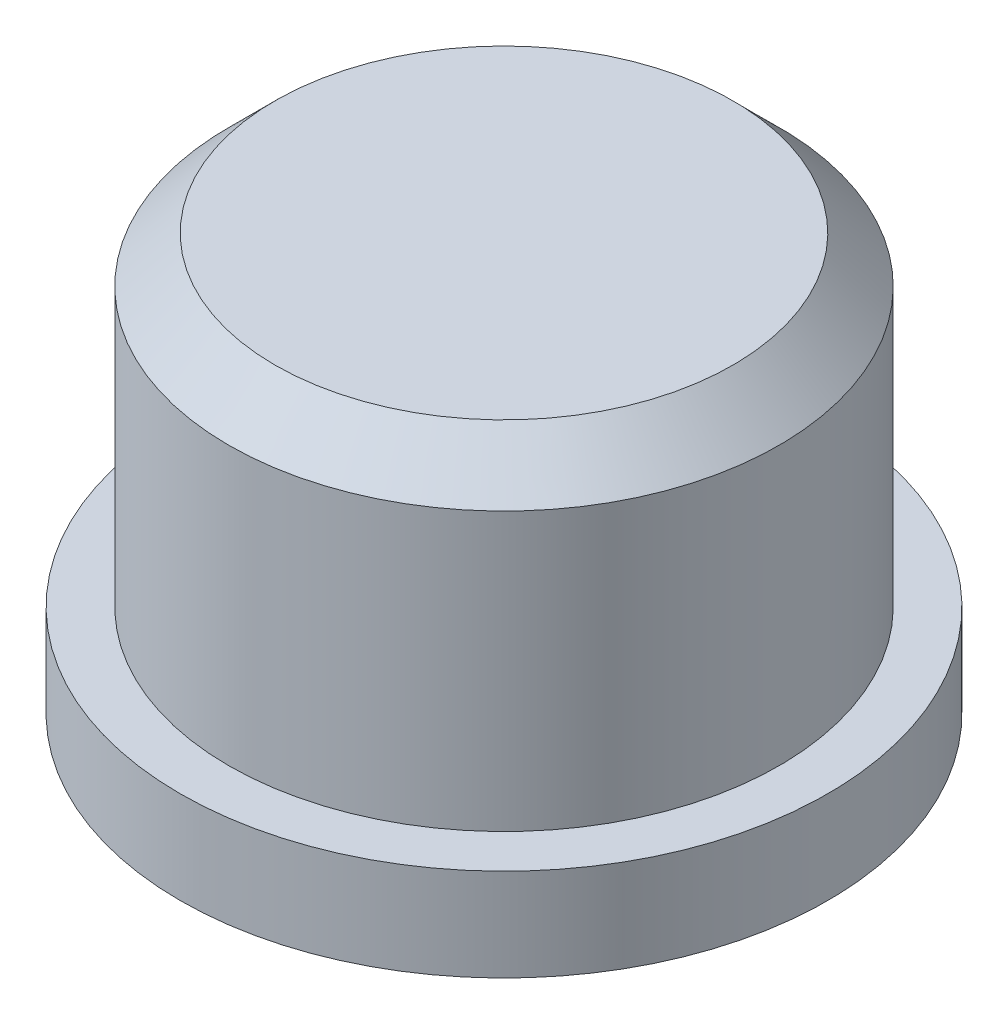
ISO-10303-21;
HEADER;
FILE_DESCRIPTION(('STEP AP214'),'2;1');
FILE_NAME('part.step','',(''),(''),'','','');
FILE_SCHEMA(('AUTOMOTIVE_DESIGN { 1 0 10303 214 1 1 1 1 }'));
ENDSEC;
DATA;
#1=APPLICATION_CONTEXT('core data for automotive mechanical design processes');
#2=APPLICATION_PROTOCOL_DEFINITION('international standard','automotive_design',2000,#1);
#3=PRODUCT_CONTEXT('',#1,'mechanical');
#4=PRODUCT('Part','Part','',(#3));
#5=PRODUCT_RELATED_PRODUCT_CATEGORY('part','',(#4));
#6=PRODUCT_DEFINITION_FORMATION('','',#4);
#7=PRODUCT_DEFINITION_CONTEXT('part definition',#1,'design');
#8=PRODUCT_DEFINITION('design','',#6,#7);
#9=PRODUCT_DEFINITION_SHAPE('','',#8);
#10=(LENGTH_UNIT() NAMED_UNIT(*) SI_UNIT(.MILLI.,.METRE.));
#11=(NAMED_UNIT(*) PLANE_ANGLE_UNIT() SI_UNIT($,.RADIAN.));
#12=(NAMED_UNIT(*) SI_UNIT($,.STERADIAN.) SOLID_ANGLE_UNIT());
#13=UNCERTAINTY_MEASURE_WITH_UNIT(LENGTH_MEASURE(1.E-05),#10,'distance_accuracy_value','');
#14=(GEOMETRIC_REPRESENTATION_CONTEXT(3) GLOBAL_UNCERTAINTY_ASSIGNED_CONTEXT((#13)) GLOBAL_UNIT_ASSIGNED_CONTEXT((#10,
#11,#12)) REPRESENTATION_CONTEXT('',''));
#15=CARTESIAN_POINT('',(0.,0.,0.));
#16=DIRECTION('',(0.,0.,1.));
#17=DIRECTION('',(1.,0.,0.));
#18=AXIS2_PLACEMENT_3D('',#15,#16,#17);
#19=CARTESIAN_POINT('',(0.,2.,0.));
#20=DIRECTION('',(0.,-1.,0.));
#21=DIRECTION('',(0.,0.,-1.));
#22=AXIS2_PLACEMENT_3D('',#19,#20,#21);
#23=CYLINDRICAL_SURFACE('',#22,7.);
#24=CARTESIAN_POINT('',(0.,2.,0.));
#25=DIRECTION('',(0.,1.,0.));
#26=DIRECTION('',(0.,0.,1.));
#27=AXIS2_PLACEMENT_3D('',#24,#25,#26);
#28=CIRCLE('',#27,7.);
#29=CARTESIAN_POINT('',(0.,2.,7.));
#30=VERTEX_POINT('',#29);
#31=EDGE_CURVE('E57',#30,#30,#28,.T.);
#32=ORIENTED_EDGE('',*,*,#31,.F.);
#33=EDGE_LOOP('',(#32));
#34=FACE_BOUND('',#33,.T.);
#35=CARTESIAN_POINT('',(0.,0.,0.));
#36=DIRECTION('',(0.,1.,0.));
#37=DIRECTION('',(0.,0.,1.));
#38=AXIS2_PLACEMENT_3D('',#35,#36,#37);
#39=CIRCLE('',#38,7.);
#40=CARTESIAN_POINT('',(0.,0.,7.));
#41=VERTEX_POINT('',#40);
#42=EDGE_CURVE('E60',#41,#41,#39,.T.);
#43=ORIENTED_EDGE('',*,*,#42,.T.);
#44=EDGE_LOOP('',(#43));
#45=FACE_BOUND('',#44,.T.);
#46=ADVANCED_FACE('F42',(#34,#45),#23,.T.);
#47=CARTESIAN_POINT('',(0.,2.,0.));
#48=DIRECTION('',(0.,1.,0.));
#49=DIRECTION('',(0.,0.,1.));
#50=AXIS2_PLACEMENT_3D('',#47,#48,#49);
#51=PLANE('',#50);
#52=CARTESIAN_POINT('',(0.,2.,0.));
#53=DIRECTION('',(0.,1.,0.));
#54=DIRECTION('',(0.,0.,1.));
#55=AXIS2_PLACEMENT_3D('',#52,#53,#54);
#56=CIRCLE('',#55,5.95);
#57=CARTESIAN_POINT('',(0.,2.,5.95));
#58=VERTEX_POINT('',#57);
#59=EDGE_CURVE('E53',#58,#58,#56,.T.);
#60=ORIENTED_EDGE('',*,*,#59,.F.);
#61=EDGE_LOOP('',(#60));
#62=FACE_BOUND('',#61,.T.);
#63=ORIENTED_EDGE('',*,*,#31,.T.);
#64=EDGE_LOOP('',(#63));
#65=FACE_BOUND('',#64,.T.);
#66=ADVANCED_FACE('F85',(#62,#65),#51,.T.);
#67=CARTESIAN_POINT('',(0.,0.,0.));
#68=DIRECTION('',(0.,1.,0.));
#69=DIRECTION('',(0.,0.,1.));
#70=AXIS2_PLACEMENT_3D('',#67,#68,#69);
#71=PLANE('',#70);
#72=CARTESIAN_POINT('',(0.,0.,0.));
#73=DIRECTION('',(0.,-1.,0.));
#74=DIRECTION('',(0.,0.,-1.));
#75=AXIS2_PLACEMENT_3D('',#72,#73,#74);
#76=CIRCLE('',#75,2.68700576850888);
#77=CARTESIAN_POINT('',(0.,0.,-2.68700576850888));
#78=VERTEX_POINT('',#77);
#79=EDGE_CURVE('E66',#78,#78,#76,.T.);
#80=ORIENTED_EDGE('',*,*,#79,.F.);
#81=EDGE_LOOP('',(#80));
#82=FACE_BOUND('',#81,.T.);
#83=ORIENTED_EDGE('',*,*,#42,.F.);
#84=EDGE_LOOP('',(#83));
#85=FACE_BOUND('',#84,.T.);
#86=ADVANCED_FACE('F81',(#82,#85),#71,.F.);
#87=CARTESIAN_POINT('',(0.,9.,0.));
#88=DIRECTION('',(0.,-1.,0.));
#89=DIRECTION('',(0.,0.,-1.));
#90=AXIS2_PLACEMENT_3D('',#87,#88,#89);
#91=CYLINDRICAL_SURFACE('',#90,5.95);
#92=CARTESIAN_POINT('',(0.,7.99999999999999,0.));
#93=DIRECTION('',(0.,1.,0.));
#94=DIRECTION('',(0.,0.,1.));
#95=AXIS2_PLACEMENT_3D('',#92,#93,#94);
#96=CIRCLE('',#95,5.95);
#97=CARTESIAN_POINT('',(0.,7.99999999999999,5.95));
#98=VERTEX_POINT('',#97);
#99=EDGE_CURVE('E12',#98,#98,#96,.F.);
#100=ORIENTED_EDGE('',*,*,#99,.T.);
#101=EDGE_LOOP('',(#100));
#102=FACE_BOUND('',#101,.T.);
#103=ORIENTED_EDGE('',*,*,#59,.T.);
#104=EDGE_LOOP('',(#103));
#105=FACE_BOUND('',#104,.T.);
#106=ADVANCED_FACE('F84',(#102,#105),#91,.T.);
#107=CARTESIAN_POINT('',(0.,9.,0.));
#108=DIRECTION('',(0.,1.,0.));
#109=DIRECTION('',(0.,0.,1.));
#110=AXIS2_PLACEMENT_3D('',#107,#108,#109);
#111=PLANE('',#110);
#112=CARTESIAN_POINT('',(0.,9.,0.));
#113=DIRECTION('',(0.,1.,0.));
#114=DIRECTION('',(0.,0.,1.));
#115=AXIS2_PLACEMENT_3D('',#112,#113,#114);
#116=CIRCLE('',#115,4.95);
#117=CARTESIAN_POINT('',(0.,9.,4.95));
#118=VERTEX_POINT('',#117);
#119=EDGE_CURVE('E49',#118,#118,#116,.T.);
#120=ORIENTED_EDGE('',*,*,#119,.T.);
#121=EDGE_LOOP('',(#120));
#122=FACE_BOUND('',#121,.T.);
#123=ADVANCED_FACE('F77',(#122),#111,.T.);
#124=CARTESIAN_POINT('',(0.,1.8,0.));
#125=DIRECTION('',(0.,-1.,0.));
#126=DIRECTION('',(0.,0.,-1.));
#127=AXIS2_PLACEMENT_3D('',#124,#125,#126);
#128=CYLINDRICAL_SURFACE('',#127,2.68700576850888);
#129=CARTESIAN_POINT('',(0.,1.8,0.));
#130=DIRECTION('',(0.,-1.,0.));
#131=DIRECTION('',(0.,0.,-1.));
#132=AXIS2_PLACEMENT_3D('',#129,#130,#131);
#133=CIRCLE('',#132,2.68700576850888);
#134=CARTESIAN_POINT('',(0.,1.8,-2.68700576850888));
#135=VERTEX_POINT('',#134);
#136=EDGE_CURVE('E63',#135,#135,#133,.T.);
#137=ORIENTED_EDGE('',*,*,#136,.F.);
#138=EDGE_LOOP('',(#137));
#139=FACE_BOUND('',#138,.T.);
#140=ORIENTED_EDGE('',*,*,#79,.T.);
#141=EDGE_LOOP('',(#140));
#142=FACE_BOUND('',#141,.T.);
#143=ADVANCED_FACE('F74',(#139,#142),#128,.F.);
#144=CARTESIAN_POINT('',(0.,1.8,0.));
#145=DIRECTION('',(0.,-1.,0.));
#146=DIRECTION('',(0.,0.,-1.));
#147=AXIS2_PLACEMENT_3D('',#144,#145,#146);
#148=PLANE('',#147);
#149=ORIENTED_EDGE('',*,*,#136,.T.);
#150=EDGE_LOOP('',(#149));
#151=FACE_BOUND('',#150,.T.);
#152=ADVANCED_FACE('F72',(#151),#148,.T.);
#153=CARTESIAN_POINT('',(0.,9.,0.));
#154=DIRECTION('',(0.,-1.,0.));
#155=DIRECTION('',(0.,0.,-1.));
#156=AXIS2_PLACEMENT_3D('',#153,#154,#155);
#157=CONICAL_SURFACE('',#156,4.95,0.785398163397447);
#158=ORIENTED_EDGE('',*,*,#99,.F.);
#159=EDGE_LOOP('',(#158));
#160=FACE_BOUND('',#159,.T.);
#161=ORIENTED_EDGE('',*,*,#119,.F.);
#162=EDGE_LOOP('',(#161));
#163=FACE_BOUND('',#162,.T.);
#164=ADVANCED_FACE('F44',(#160,#163),#157,.T.);
#165=CLOSED_SHELL('',(#46,#66,#86,#106,#123,#143,#152,#164));
#166=MANIFOLD_SOLID_BREP('B2',#165);
#167=ADVANCED_BREP_SHAPE_REPRESENTATION('',(#18,#166),#14);
#168=SHAPE_DEFINITION_REPRESENTATION(#9,#167);
ENDSEC;
END-ISO-10303-21;
